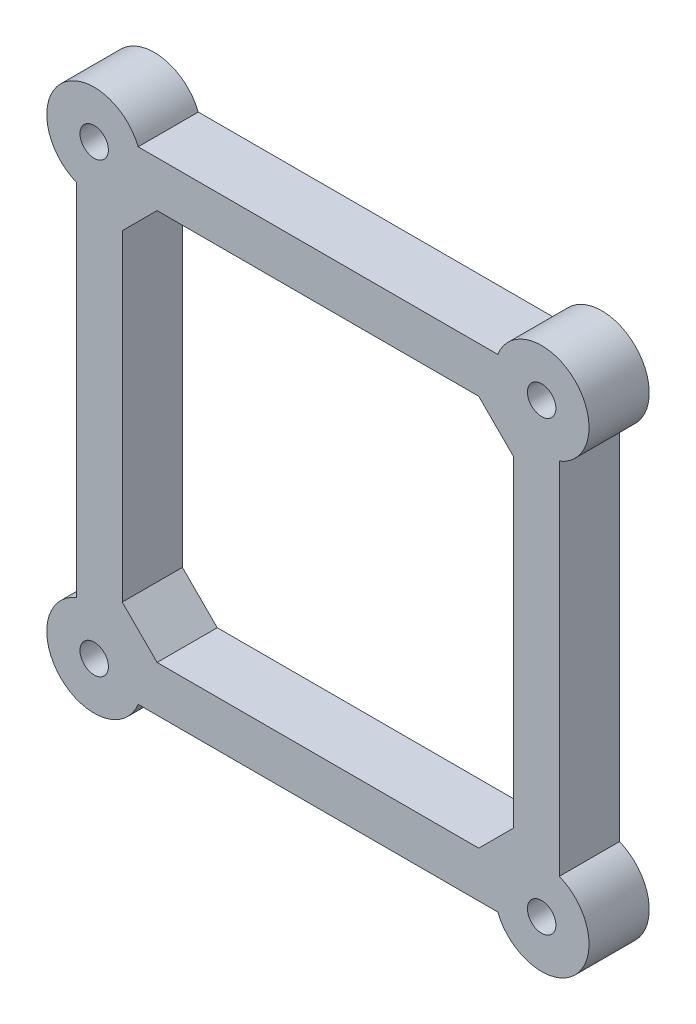
ISO-10303-21;
HEADER;
FILE_DESCRIPTION(('STEP AP214'),'2;1');
FILE_NAME('part.step','',(''),(''),'','','');
FILE_SCHEMA(('AUTOMOTIVE_DESIGN { 1 0 10303 214 1 1 1 1 }'));
ENDSEC;
DATA;
#1=APPLICATION_CONTEXT('core data for automotive mechanical design processes');
#2=APPLICATION_PROTOCOL_DEFINITION('international standard','automotive_design',2000,#1);
#3=PRODUCT_CONTEXT('',#1,'mechanical');
#4=PRODUCT('Part','Part','',(#3));
#5=PRODUCT_RELATED_PRODUCT_CATEGORY('part','',(#4));
#6=PRODUCT_DEFINITION_FORMATION('','',#4);
#7=PRODUCT_DEFINITION_CONTEXT('part definition',#1,'design');
#8=PRODUCT_DEFINITION('design','',#6,#7);
#9=PRODUCT_DEFINITION_SHAPE('','',#8);
#10=(LENGTH_UNIT() NAMED_UNIT(*) SI_UNIT(.MILLI.,.METRE.));
#11=(NAMED_UNIT(*) PLANE_ANGLE_UNIT() SI_UNIT($,.RADIAN.));
#12=(NAMED_UNIT(*) SI_UNIT($,.STERADIAN.) SOLID_ANGLE_UNIT());
#13=UNCERTAINTY_MEASURE_WITH_UNIT(LENGTH_MEASURE(1.E-05),#10,'distance_accuracy_value','');
#14=(GEOMETRIC_REPRESENTATION_CONTEXT(3) GLOBAL_UNCERTAINTY_ASSIGNED_CONTEXT((#13)) GLOBAL_UNIT_ASSIGNED_CONTEXT((#10,
#11,#12)) REPRESENTATION_CONTEXT('',''));
#15=CARTESIAN_POINT('',(0.,0.,0.));
#16=DIRECTION('',(0.,0.,1.));
#17=DIRECTION('',(1.,0.,0.));
#18=AXIS2_PLACEMENT_3D('',#15,#16,#17);
#19=CARTESIAN_POINT('',(0.,0.,6.35));
#20=DIRECTION('',(0.,0.,-1.));
#21=DIRECTION('',(-1.,0.,0.));
#22=AXIS2_PLACEMENT_3D('',#19,#20,#21);
#23=PLANE('',#22);
#24=CARTESIAN_POINT('',(-23.6083318395133,-23.6083318395134,6.35));
#25=DIRECTION('',(0.,0.,1.));
#26=DIRECTION('',(1.,0.,0.));
#27=AXIS2_PLACEMENT_3D('',#24,#25,#26);
#28=CIRCLE('',#27,1.5);
#29=CARTESIAN_POINT('',(-22.1083318395133,-23.6083318395134,6.35));
#30=VERTEX_POINT('',#29);
#31=EDGE_CURVE('E594',#30,#30,#28,.T.);
#32=ORIENTED_EDGE('',*,*,#31,.F.);
#33=EDGE_LOOP('',(#32));
#34=FACE_BOUND('',#33,.T.);
#35=CARTESIAN_POINT('',(23.6083318395133,-23.6083318395134,6.35));
#36=DIRECTION('',(0.,0.,1.));
#37=DIRECTION('',(1.,0.,0.));
#38=AXIS2_PLACEMENT_3D('',#35,#36,#37);
#39=CIRCLE('',#38,1.5);
#40=CARTESIAN_POINT('',(25.1083318395133,-23.6083318395134,6.35));
#41=VERTEX_POINT('',#40);
#42=EDGE_CURVE('E598',#41,#41,#39,.T.);
#43=ORIENTED_EDGE('',*,*,#42,.F.);
#44=EDGE_LOOP('',(#43));
#45=FACE_BOUND('',#44,.T.);
#46=CARTESIAN_POINT('',(23.6083318395133,23.6083318395134,6.35));
#47=DIRECTION('',(0.,0.,1.));
#48=DIRECTION('',(1.,0.,0.));
#49=AXIS2_PLACEMENT_3D('',#46,#47,#48);
#50=CIRCLE('',#49,1.5);
#51=CARTESIAN_POINT('',(25.1083318395133,23.6083318395134,6.35));
#52=VERTEX_POINT('',#51);
#53=EDGE_CURVE('E614',#52,#52,#50,.T.);
#54=ORIENTED_EDGE('',*,*,#53,.F.);
#55=EDGE_LOOP('',(#54));
#56=FACE_BOUND('',#55,.T.);
#57=CARTESIAN_POINT('',(-23.6083318395133,23.6083318395134,6.35));
#58=DIRECTION('',(0.,0.,1.));
#59=DIRECTION('',(1.,0.,0.));
#60=AXIS2_PLACEMENT_3D('',#57,#58,#59);
#61=CIRCLE('',#60,1.5);
#62=CARTESIAN_POINT('',(-22.1083318395133,23.6083318395134,6.35));
#63=VERTEX_POINT('',#62);
#64=EDGE_CURVE('E606',#63,#63,#61,.T.);
#65=ORIENTED_EDGE('',*,*,#64,.F.);
#66=EDGE_LOOP('',(#65));
#67=FACE_BOUND('',#66,.T.);
#68=DIRECTION('',(1.,0.,0.));
#69=VECTOR('',#68,1.);
#70=CARTESIAN_POINT('',(18.97,-25.4753823869162,6.35));
#71=LINE('',#70,#69);
#72=CARTESIAN_POINT('',(-18.97,-25.4753823869162,6.35));
#73=VERTEX_POINT('',#72);
#74=CARTESIAN_POINT('',(18.97,-25.4753823869162,6.35));
#75=VERTEX_POINT('',#74);
#76=EDGE_CURVE('E167',#73,#75,#71,.T.);
#77=ORIENTED_EDGE('',*,*,#76,.T.);
#78=CARTESIAN_POINT('',(23.6083318395133,-23.6083318395134,6.35));
#79=DIRECTION('',(0.,0.,-1.));
#80=DIRECTION('',(-1.,0.,0.));
#81=AXIS2_PLACEMENT_3D('',#78,#79,#80);
#82=CIRCLE('',#81,5.);
#83=CARTESIAN_POINT('',(25.4753823869162,-18.9700000000001,6.35));
#84=VERTEX_POINT('',#83);
#85=EDGE_CURVE('E153',#75,#84,#82,.F.);
#86=ORIENTED_EDGE('',*,*,#85,.T.);
#87=DIRECTION('',(0.,1.,0.));
#88=VECTOR('',#87,1.);
#89=CARTESIAN_POINT('',(25.4753823869162,18.97,6.35));
#90=LINE('',#89,#88);
#91=CARTESIAN_POINT('',(25.4753823869161,18.9700000000001,6.35));
#92=VERTEX_POINT('',#91);
#93=EDGE_CURVE('E175',#84,#92,#90,.T.);
#94=ORIENTED_EDGE('',*,*,#93,.T.);
#95=CARTESIAN_POINT('',(23.6083318395133,23.6083318395134,6.35));
#96=DIRECTION('',(0.,0.,-1.));
#97=DIRECTION('',(-1.,0.,0.));
#98=AXIS2_PLACEMENT_3D('',#95,#96,#97);
#99=CIRCLE('',#98,5.);
#100=CARTESIAN_POINT('',(18.97,25.4753823869162,6.35));
#101=VERTEX_POINT('',#100);
#102=EDGE_CURVE('E236',#101,#92,#99,.T.);
#103=ORIENTED_EDGE('',*,*,#102,.F.);
#104=DIRECTION('',(-1.,0.,0.));
#105=VECTOR('',#104,1.);
#106=CARTESIAN_POINT('',(-18.97,25.4753823869162,6.35));
#107=LINE('',#106,#105);
#108=CARTESIAN_POINT('',(-18.97,25.4753823869162,6.35));
#109=VERTEX_POINT('',#108);
#110=EDGE_CURVE('E321',#101,#109,#107,.T.);
#111=ORIENTED_EDGE('',*,*,#110,.T.);
#112=CARTESIAN_POINT('',(-23.6083318395133,23.6083318395134,6.35));
#113=DIRECTION('',(0.,0.,-1.));
#114=DIRECTION('',(-1.,0.,0.));
#115=AXIS2_PLACEMENT_3D('',#112,#113,#114);
#116=CIRCLE('',#115,5.);
#117=CARTESIAN_POINT('',(-25.4753823869162,18.9700000000001,6.35));
#118=VERTEX_POINT('',#117);
#119=EDGE_CURVE('E237',#109,#118,#116,.F.);
#120=ORIENTED_EDGE('',*,*,#119,.T.);
#121=DIRECTION('',(0.,-1.,0.));
#122=VECTOR('',#121,1.);
#123=CARTESIAN_POINT('',(-25.4753823869162,-18.97,6.35));
#124=LINE('',#123,#122);
#125=CARTESIAN_POINT('',(-25.4753823869161,-18.9700000000001,6.35));
#126=VERTEX_POINT('',#125);
#127=EDGE_CURVE('E196',#118,#126,#124,.T.);
#128=ORIENTED_EDGE('',*,*,#127,.T.);
#129=CARTESIAN_POINT('',(-23.6083318395133,-23.6083318395134,6.35));
#130=DIRECTION('',(0.,0.,-1.));
#131=DIRECTION('',(-1.,0.,0.));
#132=AXIS2_PLACEMENT_3D('',#129,#130,#131);
#133=CIRCLE('',#132,5.);
#134=EDGE_CURVE('E170',#73,#126,#133,.T.);
#135=ORIENTED_EDGE('',*,*,#134,.F.);
#136=EDGE_LOOP('',(#77,#86,#94,#103,#111,#120,#128,#135));
#137=FACE_BOUND('',#136,.T.);
#138=DIRECTION('',(1.,0.,0.));
#139=VECTOR('',#138,1.);
#140=CARTESIAN_POINT('',(16.97,-20.6455410486077,6.35));
#141=LINE('',#140,#139);
#142=CARTESIAN_POINT('',(-16.97,-20.6455410486077,6.35));
#143=VERTEX_POINT('',#142);
#144=CARTESIAN_POINT('',(16.97,-20.6455410486077,6.35));
#145=VERTEX_POINT('',#144);
#146=EDGE_CURVE('E247',#143,#145,#141,.T.);
#147=ORIENTED_EDGE('',*,*,#146,.F.);
#148=DIRECTION('',(0.707106781186548,-0.707106781186548,0.));
#149=VECTOR('',#148,1.);
#150=CARTESIAN_POINT('',(-16.97,-20.6455410486077,6.35));
#151=LINE('',#150,#149);
#152=CARTESIAN_POINT('',(-20.6455410486077,-16.97,6.35));
#153=VERTEX_POINT('',#152);
#154=EDGE_CURVE('E269',#153,#143,#151,.T.);
#155=ORIENTED_EDGE('',*,*,#154,.F.);
#156=DIRECTION('',(0.,-1.,0.));
#157=VECTOR('',#156,1.);
#158=CARTESIAN_POINT('',(-20.6455410486077,-16.97,6.35));
#159=LINE('',#158,#157);
#160=CARTESIAN_POINT('',(-20.6455410486077,16.97,6.35));
#161=VERTEX_POINT('',#160);
#162=EDGE_CURVE('E266',#161,#153,#159,.T.);
#163=ORIENTED_EDGE('',*,*,#162,.F.);
#164=DIRECTION('',(-0.707106781186548,-0.707106781186548,0.));
#165=VECTOR('',#164,1.);
#166=CARTESIAN_POINT('',(-20.6455410486077,16.97,6.35));
#167=LINE('',#166,#165);
#168=CARTESIAN_POINT('',(-16.97,20.6455410486077,6.35));
#169=VERTEX_POINT('',#168);
#170=EDGE_CURVE('E263',#169,#161,#167,.T.);
#171=ORIENTED_EDGE('',*,*,#170,.F.);
#172=DIRECTION('',(-1.,0.,0.));
#173=VECTOR('',#172,1.);
#174=CARTESIAN_POINT('',(-16.97,20.6455410486077,6.35));
#175=LINE('',#174,#173);
#176=CARTESIAN_POINT('',(16.97,20.6455410486077,6.35));
#177=VERTEX_POINT('',#176);
#178=EDGE_CURVE('E260',#177,#169,#175,.T.);
#179=ORIENTED_EDGE('',*,*,#178,.F.);
#180=DIRECTION('',(-0.707106781186548,0.707106781186548,0.));
#181=VECTOR('',#180,1.);
#182=CARTESIAN_POINT('',(16.97,20.6455410486077,6.35));
#183=LINE('',#182,#181);
#184=CARTESIAN_POINT('',(20.6455410486077,16.97,6.35));
#185=VERTEX_POINT('',#184);
#186=EDGE_CURVE('E257',#185,#177,#183,.T.);
#187=ORIENTED_EDGE('',*,*,#186,.F.);
#188=DIRECTION('',(0.,1.,0.));
#189=VECTOR('',#188,1.);
#190=CARTESIAN_POINT('',(20.6455410486077,16.97,6.35));
#191=LINE('',#190,#189);
#192=CARTESIAN_POINT('',(20.6455410486077,-16.97,6.35));
#193=VERTEX_POINT('',#192);
#194=EDGE_CURVE('E254',#193,#185,#191,.T.);
#195=ORIENTED_EDGE('',*,*,#194,.F.);
#196=DIRECTION('',(0.707106781186548,0.707106781186548,0.));
#197=VECTOR('',#196,1.);
#198=CARTESIAN_POINT('',(20.6455410486077,-16.97,6.35));
#199=LINE('',#198,#197);
#200=EDGE_CURVE('E250',#145,#193,#199,.T.);
#201=ORIENTED_EDGE('',*,*,#200,.F.);
#202=EDGE_LOOP('',(#147,#155,#163,#171,#179,#187,#195,#201));
#203=FACE_BOUND('',#202,.T.);
#204=ADVANCED_FACE('F39',(#34,#45,#56,#67,#137,#203),#23,.F.);
#205=CARTESIAN_POINT('',(0.,0.,0.));
#206=DIRECTION('',(0.,0.,-1.));
#207=DIRECTION('',(-1.,0.,0.));
#208=AXIS2_PLACEMENT_3D('',#205,#206,#207);
#209=PLANE('',#208);
#210=CARTESIAN_POINT('',(-23.6083318395133,-23.6083318395134,0.));
#211=DIRECTION('',(0.,0.,1.));
#212=DIRECTION('',(1.,0.,0.));
#213=AXIS2_PLACEMENT_3D('',#210,#211,#212);
#214=CIRCLE('',#213,1.5);
#215=CARTESIAN_POINT('',(-22.1083318395133,-23.6083318395134,0.));
#216=VERTEX_POINT('',#215);
#217=EDGE_CURVE('E592',#216,#216,#214,.T.);
#218=ORIENTED_EDGE('',*,*,#217,.T.);
#219=EDGE_LOOP('',(#218));
#220=FACE_BOUND('',#219,.T.);
#221=CARTESIAN_POINT('',(23.6083318395133,-23.6083318395134,0.));
#222=DIRECTION('',(0.,0.,1.));
#223=DIRECTION('',(1.,0.,0.));
#224=AXIS2_PLACEMENT_3D('',#221,#222,#223);
#225=CIRCLE('',#224,1.5);
#226=CARTESIAN_POINT('',(25.1083318395133,-23.6083318395134,0.));
#227=VERTEX_POINT('',#226);
#228=EDGE_CURVE('E618',#227,#227,#225,.T.);
#229=ORIENTED_EDGE('',*,*,#228,.T.);
#230=EDGE_LOOP('',(#229));
#231=FACE_BOUND('',#230,.T.);
#232=CARTESIAN_POINT('',(23.6083318395133,23.6083318395134,0.));
#233=DIRECTION('',(0.,0.,1.));
#234=DIRECTION('',(1.,0.,0.));
#235=AXIS2_PLACEMENT_3D('',#232,#233,#234);
#236=CIRCLE('',#235,1.5);
#237=CARTESIAN_POINT('',(25.1083318395133,23.6083318395134,0.));
#238=VERTEX_POINT('',#237);
#239=EDGE_CURVE('E609',#238,#238,#236,.T.);
#240=ORIENTED_EDGE('',*,*,#239,.T.);
#241=EDGE_LOOP('',(#240));
#242=FACE_BOUND('',#241,.T.);
#243=CARTESIAN_POINT('',(-23.6083318395133,23.6083318395134,0.));
#244=DIRECTION('',(0.,0.,1.));
#245=DIRECTION('',(1.,0.,0.));
#246=AXIS2_PLACEMENT_3D('',#243,#244,#245);
#247=CIRCLE('',#246,1.5);
#248=CARTESIAN_POINT('',(-22.1083318395133,23.6083318395134,0.));
#249=VERTEX_POINT('',#248);
#250=EDGE_CURVE('E602',#249,#249,#247,.T.);
#251=ORIENTED_EDGE('',*,*,#250,.T.);
#252=EDGE_LOOP('',(#251));
#253=FACE_BOUND('',#252,.T.);
#254=DIRECTION('',(0.,1.,0.));
#255=VECTOR('',#254,1.);
#256=CARTESIAN_POINT('',(25.4753823869162,18.97,0.));
#257=LINE('',#256,#255);
#258=CARTESIAN_POINT('',(25.4753823869162,-18.97,0.));
#259=VERTEX_POINT('',#258);
#260=CARTESIAN_POINT('',(25.4753823869161,18.9700000000001,0.));
#261=VERTEX_POINT('',#260);
#262=EDGE_CURVE('E185',#259,#261,#257,.T.);
#263=ORIENTED_EDGE('',*,*,#262,.F.);
#264=CARTESIAN_POINT('',(23.6083318395133,-23.6083318395134,0.));
#265=DIRECTION('',(0.,0.,-1.));
#266=DIRECTION('',(1.,0.,0.));
#267=AXIS2_PLACEMENT_3D('',#264,#265,#266);
#268=CIRCLE('',#267,5.);
#269=CARTESIAN_POINT('',(18.97,-25.4753823869162,0.));
#270=VERTEX_POINT('',#269);
#271=EDGE_CURVE('E164',#259,#270,#268,.T.);
#272=ORIENTED_EDGE('',*,*,#271,.T.);
#273=DIRECTION('',(1.,0.,0.));
#274=VECTOR('',#273,1.);
#275=CARTESIAN_POINT('',(18.97,-25.4753823869162,0.));
#276=LINE('',#275,#274);
#277=CARTESIAN_POINT('',(-18.97,-25.4753823869162,0.));
#278=VERTEX_POINT('',#277);
#279=EDGE_CURVE('E180',#278,#270,#276,.T.);
#280=ORIENTED_EDGE('',*,*,#279,.F.);
#281=CARTESIAN_POINT('',(-23.6083318395133,-23.6083318395134,0.));
#282=DIRECTION('',(0.,0.,1.));
#283=DIRECTION('',(-1.,0.,0.));
#284=AXIS2_PLACEMENT_3D('',#281,#282,#283);
#285=CIRCLE('',#284,5.);
#286=CARTESIAN_POINT('',(-25.4753823869161,-18.9700000000001,0.));
#287=VERTEX_POINT('',#286);
#288=EDGE_CURVE('E163',#287,#278,#285,.T.);
#289=ORIENTED_EDGE('',*,*,#288,.F.);
#290=DIRECTION('',(0.,-1.,0.));
#291=VECTOR('',#290,1.);
#292=CARTESIAN_POINT('',(-25.4753823869162,-18.97,0.));
#293=LINE('',#292,#291);
#294=CARTESIAN_POINT('',(-25.4753823869162,18.97,0.));
#295=VERTEX_POINT('',#294);
#296=EDGE_CURVE('E176',#295,#287,#293,.T.);
#297=ORIENTED_EDGE('',*,*,#296,.F.);
#298=CARTESIAN_POINT('',(-23.6083318395133,23.6083318395134,0.));
#299=DIRECTION('',(0.,0.,-1.));
#300=DIRECTION('',(-1.,0.,0.));
#301=AXIS2_PLACEMENT_3D('',#298,#299,#300);
#302=CIRCLE('',#301,5.);
#303=CARTESIAN_POINT('',(-18.97,25.4753823869162,0.));
#304=VERTEX_POINT('',#303);
#305=EDGE_CURVE('E243',#295,#304,#302,.T.);
#306=ORIENTED_EDGE('',*,*,#305,.T.);
#307=DIRECTION('',(-1.,0.,0.));
#308=VECTOR('',#307,1.);
#309=CARTESIAN_POINT('',(-18.97,25.4753823869162,0.));
#310=LINE('',#309,#308);
#311=CARTESIAN_POINT('',(18.97,25.4753823869162,0.));
#312=VERTEX_POINT('',#311);
#313=EDGE_CURVE('E191',#312,#304,#310,.T.);
#314=ORIENTED_EDGE('',*,*,#313,.F.);
#315=CARTESIAN_POINT('',(23.6083318395133,23.6083318395134,0.));
#316=DIRECTION('',(0.,0.,1.));
#317=DIRECTION('',(1.,0.,0.));
#318=AXIS2_PLACEMENT_3D('',#315,#316,#317);
#319=CIRCLE('',#318,5.);
#320=EDGE_CURVE('E232',#261,#312,#319,.T.);
#321=ORIENTED_EDGE('',*,*,#320,.F.);
#322=EDGE_LOOP('',(#263,#272,#280,#289,#297,#306,#314,#321));
#323=FACE_BOUND('',#322,.T.);
#324=DIRECTION('',(0.707106781186548,-0.707106781186548,0.));
#325=VECTOR('',#324,1.);
#326=CARTESIAN_POINT('',(-16.97,-20.6455410486077,0.));
#327=LINE('',#326,#325);
#328=CARTESIAN_POINT('',(-20.6455410486077,-16.97,0.));
#329=VERTEX_POINT('',#328);
#330=CARTESIAN_POINT('',(-16.97,-20.6455410486077,0.));
#331=VERTEX_POINT('',#330);
#332=EDGE_CURVE('E251',#329,#331,#327,.T.);
#333=ORIENTED_EDGE('',*,*,#332,.T.);
#334=DIRECTION('',(1.,0.,0.));
#335=VECTOR('',#334,1.);
#336=CARTESIAN_POINT('',(16.97,-20.6455410486077,0.));
#337=LINE('',#336,#335);
#338=CARTESIAN_POINT('',(16.97,-20.6455410486077,0.));
#339=VERTEX_POINT('',#338);
#340=EDGE_CURVE('E63',#331,#339,#337,.T.);
#341=ORIENTED_EDGE('',*,*,#340,.T.);
#342=DIRECTION('',(0.707106781186548,0.707106781186548,0.));
#343=VECTOR('',#342,1.);
#344=CARTESIAN_POINT('',(20.6455410486077,-16.97,0.));
#345=LINE('',#344,#343);
#346=CARTESIAN_POINT('',(20.6455410486077,-16.97,0.));
#347=VERTEX_POINT('',#346);
#348=EDGE_CURVE('E275',#339,#347,#345,.T.);
#349=ORIENTED_EDGE('',*,*,#348,.T.);
#350=DIRECTION('',(0.,1.,0.));
#351=VECTOR('',#350,1.);
#352=CARTESIAN_POINT('',(20.6455410486077,16.97,0.));
#353=LINE('',#352,#351);
#354=CARTESIAN_POINT('',(20.6455410486077,16.97,0.));
#355=VERTEX_POINT('',#354);
#356=EDGE_CURVE('E279',#347,#355,#353,.T.);
#357=ORIENTED_EDGE('',*,*,#356,.T.);
#358=DIRECTION('',(-0.707106781186548,0.707106781186548,0.));
#359=VECTOR('',#358,1.);
#360=CARTESIAN_POINT('',(16.97,20.6455410486077,0.));
#361=LINE('',#360,#359);
#362=CARTESIAN_POINT('',(16.97,20.6455410486077,0.));
#363=VERTEX_POINT('',#362);
#364=EDGE_CURVE('E283',#355,#363,#361,.T.);
#365=ORIENTED_EDGE('',*,*,#364,.T.);
#366=DIRECTION('',(-1.,0.,0.));
#367=VECTOR('',#366,1.);
#368=CARTESIAN_POINT('',(-16.97,20.6455410486077,0.));
#369=LINE('',#368,#367);
#370=CARTESIAN_POINT('',(-16.97,20.6455410486077,0.));
#371=VERTEX_POINT('',#370);
#372=EDGE_CURVE('E287',#363,#371,#369,.T.);
#373=ORIENTED_EDGE('',*,*,#372,.T.);
#374=DIRECTION('',(-0.707106781186548,-0.707106781186548,0.));
#375=VECTOR('',#374,1.);
#376=CARTESIAN_POINT('',(-20.6455410486077,16.97,0.));
#377=LINE('',#376,#375);
#378=CARTESIAN_POINT('',(-20.6455410486077,16.97,0.));
#379=VERTEX_POINT('',#378);
#380=EDGE_CURVE('E291',#371,#379,#377,.T.);
#381=ORIENTED_EDGE('',*,*,#380,.T.);
#382=DIRECTION('',(0.,-1.,0.));
#383=VECTOR('',#382,1.);
#384=CARTESIAN_POINT('',(-20.6455410486077,-16.97,0.));
#385=LINE('',#384,#383);
#386=EDGE_CURVE('E295',#379,#329,#385,.T.);
#387=ORIENTED_EDGE('',*,*,#386,.T.);
#388=EDGE_LOOP('',(#333,#341,#349,#357,#365,#373,#381,#387));
#389=FACE_BOUND('',#388,.T.);
#390=ADVANCED_FACE('F229',(#220,#231,#242,#253,#323,#389),#209,.T.);
#391=CARTESIAN_POINT('',(18.97,-25.4753823869162,6.35));
#392=DIRECTION('',(0.,1.,0.));
#393=DIRECTION('',(-1.,0.,0.));
#394=AXIS2_PLACEMENT_3D('',#391,#392,#393);
#395=PLANE('',#394);
#396=ORIENTED_EDGE('',*,*,#279,.T.);
#397=DIRECTION('',(0.,0.,-1.));
#398=VECTOR('',#397,1.);
#399=CARTESIAN_POINT('',(18.97,-25.4753823869162,6.35));
#400=LINE('',#399,#398);
#401=EDGE_CURVE('E11',#75,#270,#400,.T.);
#402=ORIENTED_EDGE('',*,*,#401,.F.);
#403=ORIENTED_EDGE('',*,*,#76,.F.);
#404=DIRECTION('',(0.,0.,-1.));
#405=VECTOR('',#404,1.);
#406=CARTESIAN_POINT('',(-18.97,-25.4753823869162,6.35));
#407=LINE('',#406,#405);
#408=EDGE_CURVE('E181',#73,#278,#407,.T.);
#409=ORIENTED_EDGE('',*,*,#408,.T.);
#410=EDGE_LOOP('',(#396,#402,#403,#409));
#411=FACE_BOUND('',#410,.T.);
#412=ADVANCED_FACE('F41',(#411),#395,.F.);
#413=CARTESIAN_POINT('',(25.4753823869162,18.97,6.35));
#414=DIRECTION('',(-1.,0.,0.));
#415=DIRECTION('',(0.,0.,1.));
#416=AXIS2_PLACEMENT_3D('',#413,#414,#415);
#417=PLANE('',#416);
#418=ORIENTED_EDGE('',*,*,#262,.T.);
#419=DIRECTION('',(0.,0.,-1.));
#420=VECTOR('',#419,1.);
#421=CARTESIAN_POINT('',(25.4753823869162,18.97,6.35));
#422=LINE('',#421,#420);
#423=EDGE_CURVE('E221',#92,#261,#422,.T.);
#424=ORIENTED_EDGE('',*,*,#423,.F.);
#425=ORIENTED_EDGE('',*,*,#93,.F.);
#426=DIRECTION('',(0.,0.,-1.));
#427=VECTOR('',#426,1.);
#428=CARTESIAN_POINT('',(25.4753823869162,-18.97,6.35));
#429=LINE('',#428,#427);
#430=EDGE_CURVE('E48',#84,#259,#429,.T.);
#431=ORIENTED_EDGE('',*,*,#430,.T.);
#432=EDGE_LOOP('',(#418,#424,#425,#431));
#433=FACE_BOUND('',#432,.T.);
#434=ADVANCED_FACE('F226',(#433),#417,.F.);
#435=CARTESIAN_POINT('',(-18.97,25.4753823869162,6.35));
#436=DIRECTION('',(0.,-1.,0.));
#437=DIRECTION('',(0.,0.,-1.));
#438=AXIS2_PLACEMENT_3D('',#435,#436,#437);
#439=PLANE('',#438);
#440=ORIENTED_EDGE('',*,*,#313,.T.);
#441=DIRECTION('',(0.,0.,-1.));
#442=VECTOR('',#441,1.);
#443=CARTESIAN_POINT('',(-18.97,25.4753823869162,6.35));
#444=LINE('',#443,#442);
#445=EDGE_CURVE('E214',#109,#304,#444,.T.);
#446=ORIENTED_EDGE('',*,*,#445,.F.);
#447=ORIENTED_EDGE('',*,*,#110,.F.);
#448=DIRECTION('',(0.,0.,-1.));
#449=VECTOR('',#448,1.);
#450=CARTESIAN_POINT('',(18.97,25.4753823869162,6.35));
#451=LINE('',#450,#449);
#452=EDGE_CURVE('E217',#101,#312,#451,.T.);
#453=ORIENTED_EDGE('',*,*,#452,.T.);
#454=EDGE_LOOP('',(#440,#446,#447,#453));
#455=FACE_BOUND('',#454,.T.);
#456=ADVANCED_FACE('F343',(#455),#439,.F.);
#457=CARTESIAN_POINT('',(-25.4753823869162,-18.97,6.35));
#458=DIRECTION('',(1.,0.,0.));
#459=DIRECTION('',(0.,0.,-1.));
#460=AXIS2_PLACEMENT_3D('',#457,#458,#459);
#461=PLANE('',#460);
#462=ORIENTED_EDGE('',*,*,#296,.T.);
#463=DIRECTION('',(0.,0.,-1.));
#464=VECTOR('',#463,1.);
#465=CARTESIAN_POINT('',(-25.4753823869162,-18.97,6.35));
#466=LINE('',#465,#464);
#467=EDGE_CURVE('E207',#126,#287,#466,.T.);
#468=ORIENTED_EDGE('',*,*,#467,.F.);
#469=ORIENTED_EDGE('',*,*,#127,.F.);
#470=DIRECTION('',(0.,0.,-1.));
#471=VECTOR('',#470,1.);
#472=CARTESIAN_POINT('',(-25.4753823869162,18.97,6.35));
#473=LINE('',#472,#471);
#474=EDGE_CURVE('E210',#118,#295,#473,.T.);
#475=ORIENTED_EDGE('',*,*,#474,.T.);
#476=EDGE_LOOP('',(#462,#468,#469,#475));
#477=FACE_BOUND('',#476,.T.);
#478=ADVANCED_FACE('F331',(#477),#461,.F.);
#479=CARTESIAN_POINT('',(16.97,-20.6455410486077,6.35));
#480=DIRECTION('',(0.,1.,0.));
#481=DIRECTION('',(0.,0.,1.));
#482=AXIS2_PLACEMENT_3D('',#479,#480,#481);
#483=PLANE('',#482);
#484=ORIENTED_EDGE('',*,*,#340,.F.);
#485=DIRECTION('',(0.,0.,-1.));
#486=VECTOR('',#485,1.);
#487=CARTESIAN_POINT('',(-16.97,-20.6455410486077,6.35));
#488=LINE('',#487,#486);
#489=EDGE_CURVE('E272',#143,#331,#488,.T.);
#490=ORIENTED_EDGE('',*,*,#489,.F.);
#491=ORIENTED_EDGE('',*,*,#146,.T.);
#492=DIRECTION('',(0.,0.,-1.));
#493=VECTOR('',#492,1.);
#494=CARTESIAN_POINT('',(16.97,-20.6455410486077,6.35));
#495=LINE('',#494,#493);
#496=EDGE_CURVE('E186',#145,#339,#495,.T.);
#497=ORIENTED_EDGE('',*,*,#496,.T.);
#498=EDGE_LOOP('',(#484,#490,#491,#497));
#499=FACE_BOUND('',#498,.T.);
#500=ADVANCED_FACE('F367',(#499),#483,.T.);
#501=CARTESIAN_POINT('',(20.6455410486077,-16.97,6.35));
#502=DIRECTION('',(-0.707106781186548,0.707106781186548,0.));
#503=DIRECTION('',(-0.707106781186548,-0.707106781186548,0.));
#504=AXIS2_PLACEMENT_3D('',#501,#502,#503);
#505=PLANE('',#504);
#506=ORIENTED_EDGE('',*,*,#348,.F.);
#507=ORIENTED_EDGE('',*,*,#496,.F.);
#508=ORIENTED_EDGE('',*,*,#200,.T.);
#509=DIRECTION('',(0.,0.,-1.));
#510=VECTOR('',#509,1.);
#511=CARTESIAN_POINT('',(20.6455410486077,-16.97,6.35));
#512=LINE('',#511,#510);
#513=EDGE_CURVE('E193',#193,#347,#512,.T.);
#514=ORIENTED_EDGE('',*,*,#513,.T.);
#515=EDGE_LOOP('',(#506,#507,#508,#514));
#516=FACE_BOUND('',#515,.T.);
#517=ADVANCED_FACE('F523',(#516),#505,.T.);
#518=CARTESIAN_POINT('',(20.6455410486077,16.97,6.35));
#519=DIRECTION('',(-1.,0.,0.));
#520=DIRECTION('',(0.,0.,1.));
#521=AXIS2_PLACEMENT_3D('',#518,#519,#520);
#522=PLANE('',#521);
#523=ORIENTED_EDGE('',*,*,#356,.F.);
#524=ORIENTED_EDGE('',*,*,#513,.F.);
#525=ORIENTED_EDGE('',*,*,#194,.T.);
#526=DIRECTION('',(0.,0.,-1.));
#527=VECTOR('',#526,1.);
#528=CARTESIAN_POINT('',(20.6455410486077,16.97,6.35));
#529=LINE('',#528,#527);
#530=EDGE_CURVE('E315',#185,#355,#529,.T.);
#531=ORIENTED_EDGE('',*,*,#530,.T.);
#532=EDGE_LOOP('',(#523,#524,#525,#531));
#533=FACE_BOUND('',#532,.T.);
#534=ADVANCED_FACE('F513',(#533),#522,.T.);
#535=CARTESIAN_POINT('',(16.97,20.6455410486077,6.35));
#536=DIRECTION('',(-0.707106781186548,-0.707106781186548,0.));
#537=DIRECTION('',(0.707106781186548,-0.707106781186548,0.));
#538=AXIS2_PLACEMENT_3D('',#535,#536,#537);
#539=PLANE('',#538);
#540=ORIENTED_EDGE('',*,*,#364,.F.);
#541=ORIENTED_EDGE('',*,*,#530,.F.);
#542=ORIENTED_EDGE('',*,*,#186,.T.);
#543=DIRECTION('',(0.,0.,-1.));
#544=VECTOR('',#543,1.);
#545=CARTESIAN_POINT('',(16.97,20.6455410486077,6.35));
#546=LINE('',#545,#544);
#547=EDGE_CURVE('E312',#177,#363,#546,.T.);
#548=ORIENTED_EDGE('',*,*,#547,.T.);
#549=EDGE_LOOP('',(#540,#541,#542,#548));
#550=FACE_BOUND('',#549,.T.);
#551=ADVANCED_FACE('F503',(#550),#539,.T.);
#552=CARTESIAN_POINT('',(-16.97,20.6455410486077,6.35));
#553=DIRECTION('',(0.,-1.,0.));
#554=DIRECTION('',(0.,0.,-1.));
#555=AXIS2_PLACEMENT_3D('',#552,#553,#554);
#556=PLANE('',#555);
#557=ORIENTED_EDGE('',*,*,#372,.F.);
#558=ORIENTED_EDGE('',*,*,#547,.F.);
#559=ORIENTED_EDGE('',*,*,#178,.T.);
#560=DIRECTION('',(0.,0.,-1.));
#561=VECTOR('',#560,1.);
#562=CARTESIAN_POINT('',(-16.97,20.6455410486077,6.35));
#563=LINE('',#562,#561);
#564=EDGE_CURVE('E309',#169,#371,#563,.T.);
#565=ORIENTED_EDGE('',*,*,#564,.T.);
#566=EDGE_LOOP('',(#557,#558,#559,#565));
#567=FACE_BOUND('',#566,.T.);
#568=ADVANCED_FACE('F493',(#567),#556,.T.);
#569=CARTESIAN_POINT('',(-20.6455410486077,16.97,6.35));
#570=DIRECTION('',(0.707106781186548,-0.707106781186548,0.));
#571=DIRECTION('',(0.707106781186548,0.707106781186548,0.));
#572=AXIS2_PLACEMENT_3D('',#569,#570,#571);
#573=PLANE('',#572);
#574=ORIENTED_EDGE('',*,*,#380,.F.);
#575=ORIENTED_EDGE('',*,*,#564,.F.);
#576=ORIENTED_EDGE('',*,*,#170,.T.);
#577=DIRECTION('',(0.,0.,-1.));
#578=VECTOR('',#577,1.);
#579=CARTESIAN_POINT('',(-20.6455410486077,16.97,6.35));
#580=LINE('',#579,#578);
#581=EDGE_CURVE('E306',#161,#379,#580,.T.);
#582=ORIENTED_EDGE('',*,*,#581,.T.);
#583=EDGE_LOOP('',(#574,#575,#576,#582));
#584=FACE_BOUND('',#583,.T.);
#585=ADVANCED_FACE('F483',(#584),#573,.T.);
#586=CARTESIAN_POINT('',(-20.6455410486077,-16.97,6.35));
#587=DIRECTION('',(1.,0.,0.));
#588=DIRECTION('',(0.,0.,-1.));
#589=AXIS2_PLACEMENT_3D('',#586,#587,#588);
#590=PLANE('',#589);
#591=ORIENTED_EDGE('',*,*,#386,.F.);
#592=ORIENTED_EDGE('',*,*,#581,.F.);
#593=ORIENTED_EDGE('',*,*,#162,.T.);
#594=DIRECTION('',(0.,0.,-1.));
#595=VECTOR('',#594,1.);
#596=CARTESIAN_POINT('',(-20.6455410486077,-16.97,6.35));
#597=LINE('',#596,#595);
#598=EDGE_CURVE('E55',#153,#329,#597,.T.);
#599=ORIENTED_EDGE('',*,*,#598,.T.);
#600=EDGE_LOOP('',(#591,#592,#593,#599));
#601=FACE_BOUND('',#600,.T.);
#602=ADVANCED_FACE('F354',(#601),#590,.T.);
#603=CARTESIAN_POINT('',(-16.97,-20.6455410486077,6.35));
#604=DIRECTION('',(0.707106781186548,0.707106781186548,0.));
#605=DIRECTION('',(-0.707106781186548,0.707106781186548,0.));
#606=AXIS2_PLACEMENT_3D('',#603,#604,#605);
#607=PLANE('',#606);
#608=ORIENTED_EDGE('',*,*,#332,.F.);
#609=ORIENTED_EDGE('',*,*,#598,.F.);
#610=ORIENTED_EDGE('',*,*,#154,.T.);
#611=ORIENTED_EDGE('',*,*,#489,.T.);
#612=EDGE_LOOP('',(#608,#609,#610,#611));
#613=FACE_BOUND('',#612,.T.);
#614=ADVANCED_FACE('F347',(#613),#607,.T.);
#615=CARTESIAN_POINT('',(23.6083318395133,23.6083318395134,20.492135623731));
#616=DIRECTION('',(0.,0.,-1.));
#617=DIRECTION('',(-1.,0.,0.));
#618=AXIS2_PLACEMENT_3D('',#615,#616,#617);
#619=CYLINDRICAL_SURFACE('',#618,5.);
#620=ORIENTED_EDGE('',*,*,#102,.T.);
#621=ORIENTED_EDGE('',*,*,#423,.T.);
#622=ORIENTED_EDGE('',*,*,#320,.T.);
#623=ORIENTED_EDGE('',*,*,#452,.F.);
#624=EDGE_LOOP('',(#620,#621,#622,#623));
#625=FACE_BOUND('',#624,.T.);
#626=ADVANCED_FACE('F344',(#625),#619,.T.);
#627=CARTESIAN_POINT('',(-23.6083318395133,23.6083318395134,20.492135623731));
#628=DIRECTION('',(0.,0.,-1.));
#629=DIRECTION('',(-1.,0.,0.));
#630=AXIS2_PLACEMENT_3D('',#627,#628,#629);
#631=CYLINDRICAL_SURFACE('',#630,5.);
#632=ORIENTED_EDGE('',*,*,#445,.T.);
#633=ORIENTED_EDGE('',*,*,#305,.F.);
#634=ORIENTED_EDGE('',*,*,#474,.F.);
#635=ORIENTED_EDGE('',*,*,#119,.F.);
#636=EDGE_LOOP('',(#632,#633,#634,#635));
#637=FACE_BOUND('',#636,.T.);
#638=ADVANCED_FACE('F346',(#637),#631,.T.);
#639=CARTESIAN_POINT('',(-23.6083318395133,-23.6083318395134,20.492135623731));
#640=DIRECTION('',(0.,0.,-1.));
#641=DIRECTION('',(-1.,0.,0.));
#642=AXIS2_PLACEMENT_3D('',#639,#640,#641);
#643=CYLINDRICAL_SURFACE('',#642,5.);
#644=ORIENTED_EDGE('',*,*,#288,.T.);
#645=ORIENTED_EDGE('',*,*,#408,.F.);
#646=ORIENTED_EDGE('',*,*,#134,.T.);
#647=ORIENTED_EDGE('',*,*,#467,.T.);
#648=EDGE_LOOP('',(#644,#645,#646,#647));
#649=FACE_BOUND('',#648,.T.);
#650=ADVANCED_FACE('F334',(#649),#643,.T.);
#651=CARTESIAN_POINT('',(23.6083318395133,-23.6083318395134,20.492135623731));
#652=DIRECTION('',(0.,0.,-1.));
#653=DIRECTION('',(-1.,0.,0.));
#654=AXIS2_PLACEMENT_3D('',#651,#652,#653);
#655=CYLINDRICAL_SURFACE('',#654,5.);
#656=ORIENTED_EDGE('',*,*,#401,.T.);
#657=ORIENTED_EDGE('',*,*,#271,.F.);
#658=ORIENTED_EDGE('',*,*,#430,.F.);
#659=ORIENTED_EDGE('',*,*,#85,.F.);
#660=EDGE_LOOP('',(#656,#657,#658,#659));
#661=FACE_BOUND('',#660,.T.);
#662=ADVANCED_FACE('F155',(#661),#655,.T.);
#663=CARTESIAN_POINT('',(-23.6083318395133,23.6083318395134,0.));
#664=DIRECTION('',(0.,0.,1.));
#665=DIRECTION('',(1.,0.,0.));
#666=AXIS2_PLACEMENT_3D('',#663,#664,#665);
#667=CYLINDRICAL_SURFACE('',#666,1.5);
#668=ORIENTED_EDGE('',*,*,#250,.F.);
#669=EDGE_LOOP('',(#668));
#670=FACE_BOUND('',#669,.T.);
#671=ORIENTED_EDGE('',*,*,#64,.T.);
#672=EDGE_LOOP('',(#671));
#673=FACE_BOUND('',#672,.T.);
#674=ADVANCED_FACE('F394',(#670,#673),#667,.F.);
#675=CARTESIAN_POINT('',(23.6083318395133,23.6083318395134,0.));
#676=DIRECTION('',(0.,0.,1.));
#677=DIRECTION('',(1.,0.,0.));
#678=AXIS2_PLACEMENT_3D('',#675,#676,#677);
#679=CYLINDRICAL_SURFACE('',#678,1.5);
#680=ORIENTED_EDGE('',*,*,#239,.F.);
#681=EDGE_LOOP('',(#680));
#682=FACE_BOUND('',#681,.T.);
#683=ORIENTED_EDGE('',*,*,#53,.T.);
#684=EDGE_LOOP('',(#683));
#685=FACE_BOUND('',#684,.T.);
#686=ADVANCED_FACE('F399',(#682,#685),#679,.F.);
#687=CARTESIAN_POINT('',(23.6083318395133,-23.6083318395134,0.));
#688=DIRECTION('',(0.,0.,1.));
#689=DIRECTION('',(1.,0.,0.));
#690=AXIS2_PLACEMENT_3D('',#687,#688,#689);
#691=CYLINDRICAL_SURFACE('',#690,1.5);
#692=ORIENTED_EDGE('',*,*,#228,.F.);
#693=EDGE_LOOP('',(#692));
#694=FACE_BOUND('',#693,.T.);
#695=ORIENTED_EDGE('',*,*,#42,.T.);
#696=EDGE_LOOP('',(#695));
#697=FACE_BOUND('',#696,.T.);
#698=ADVANCED_FACE('F411',(#694,#697),#691,.F.);
#699=CARTESIAN_POINT('',(-23.6083318395133,-23.6083318395134,0.));
#700=DIRECTION('',(0.,0.,1.));
#701=DIRECTION('',(1.,0.,0.));
#702=AXIS2_PLACEMENT_3D('',#699,#700,#701);
#703=CYLINDRICAL_SURFACE('',#702,1.5);
#704=ORIENTED_EDGE('',*,*,#217,.F.);
#705=EDGE_LOOP('',(#704));
#706=FACE_BOUND('',#705,.T.);
#707=ORIENTED_EDGE('',*,*,#31,.T.);
#708=EDGE_LOOP('',(#707));
#709=FACE_BOUND('',#708,.T.);
#710=ADVANCED_FACE('F421',(#706,#709),#703,.F.);
#711=CLOSED_SHELL('',(#204,#390,#412,#434,#456,#478,#500,#517,#534,#551,#568,#585,#602,#614,
#626,#638,#650,#662,#674,#686,#698,#710));
#712=MANIFOLD_SOLID_BREP('B2',#711);
#713=ADVANCED_BREP_SHAPE_REPRESENTATION('',(#18,#712),#14);
#714=SHAPE_DEFINITION_REPRESENTATION(#9,#713);
ENDSEC;
END-ISO-10303-21;
